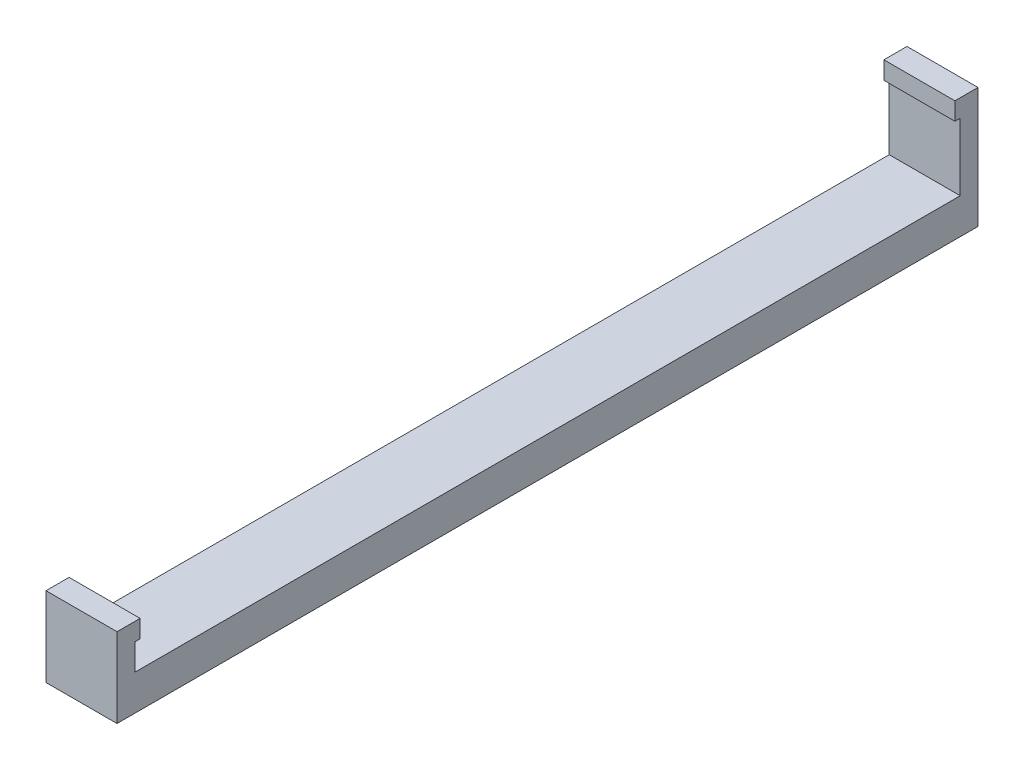
ISO-10303-21;
HEADER;
FILE_DESCRIPTION(('STEP AP214'),'2;1');
FILE_NAME('part.step','',(''),(''),'','','');
FILE_SCHEMA(('AUTOMOTIVE_DESIGN { 1 0 10303 214 1 1 1 1 }'));
ENDSEC;
DATA;
#1=APPLICATION_CONTEXT('core data for automotive mechanical design processes');
#2=APPLICATION_PROTOCOL_DEFINITION('international standard','automotive_design',2000,#1);
#3=PRODUCT_CONTEXT('',#1,'mechanical');
#4=PRODUCT('Part','Part','',(#3));
#5=PRODUCT_RELATED_PRODUCT_CATEGORY('part','',(#4));
#6=PRODUCT_DEFINITION_FORMATION('','',#4);
#7=PRODUCT_DEFINITION_CONTEXT('part definition',#1,'design');
#8=PRODUCT_DEFINITION('design','',#6,#7);
#9=PRODUCT_DEFINITION_SHAPE('','',#8);
#10=(LENGTH_UNIT() NAMED_UNIT(*) SI_UNIT(.MILLI.,.METRE.));
#11=(NAMED_UNIT(*) PLANE_ANGLE_UNIT() SI_UNIT($,.RADIAN.));
#12=(NAMED_UNIT(*) SI_UNIT($,.STERADIAN.) SOLID_ANGLE_UNIT());
#13=UNCERTAINTY_MEASURE_WITH_UNIT(LENGTH_MEASURE(1.E-05),#10,'distance_accuracy_value','');
#14=(GEOMETRIC_REPRESENTATION_CONTEXT(3) GLOBAL_UNCERTAINTY_ASSIGNED_CONTEXT((#13)) GLOBAL_UNIT_ASSIGNED_CONTEXT((#10,
#11,#12)) REPRESENTATION_CONTEXT('',''));
#15=CARTESIAN_POINT('',(0.,0.,0.));
#16=DIRECTION('',(0.,0.,1.));
#17=DIRECTION('',(1.,0.,0.));
#18=AXIS2_PLACEMENT_3D('',#15,#16,#17);
#19=CARTESIAN_POINT('',(10.,5.,0.));
#20=DIRECTION('',(-1.,0.,0.));
#21=DIRECTION('',(0.,0.,1.));
#22=AXIS2_PLACEMENT_3D('',#19,#20,#21);
#23=PLANE('',#22);
#24=DIRECTION('',(0.,0.,-1.));
#25=VECTOR('',#24,1.);
#26=CARTESIAN_POINT('',(10.,0.,0.));
#27=LINE('',#26,#25);
#28=CARTESIAN_POINT('',(10.,0.,2.5));
#29=VERTEX_POINT('',#28);
#30=CARTESIAN_POINT('',(9.99999999999998,0.,-118.72));
#31=VERTEX_POINT('',#30);
#32=EDGE_CURVE('E137',#29,#31,#27,.T.);
#33=ORIENTED_EDGE('',*,*,#32,.T.);
#34=DIRECTION('',(0.,1.,0.));
#35=VECTOR('',#34,1.);
#36=CARTESIAN_POINT('',(9.99999999999998,14.45,-118.72));
#37=LINE('',#36,#35);
#38=CARTESIAN_POINT('',(9.99999999999998,16.95,-118.72));
#39=VERTEX_POINT('',#38);
#40=EDGE_CURVE('E144',#31,#39,#37,.T.);
#41=ORIENTED_EDGE('',*,*,#40,.T.);
#42=DIRECTION('',(0.,0.,1.));
#43=VECTOR('',#42,1.);
#44=CARTESIAN_POINT('',(9.99999999999998,16.95,-118.72));
#45=LINE('',#44,#43);
#46=CARTESIAN_POINT('',(9.99999999999998,16.95,-115.47));
#47=VERTEX_POINT('',#46);
#48=EDGE_CURVE('E177',#39,#47,#45,.T.);
#49=ORIENTED_EDGE('',*,*,#48,.T.);
#50=DIRECTION('',(0.,-1.,0.));
#51=VECTOR('',#50,1.);
#52=CARTESIAN_POINT('',(9.99999999999998,14.45,-115.47));
#53=LINE('',#52,#51);
#54=CARTESIAN_POINT('',(9.99999999999998,14.45,-115.47));
#55=VERTEX_POINT('',#54);
#56=EDGE_CURVE('E181',#47,#55,#53,.T.);
#57=ORIENTED_EDGE('',*,*,#56,.T.);
#58=DIRECTION('',(0.,0.,-1.));
#59=VECTOR('',#58,1.);
#60=CARTESIAN_POINT('',(9.99999999999998,14.45,-115.47));
#61=LINE('',#60,#59);
#62=CARTESIAN_POINT('',(9.99999999999998,14.45,-116.22));
#63=VERTEX_POINT('',#62);
#64=EDGE_CURVE('E162',#55,#63,#61,.T.);
#65=ORIENTED_EDGE('',*,*,#64,.T.);
#66=DIRECTION('',(0.,-1.,0.));
#67=VECTOR('',#66,1.);
#68=CARTESIAN_POINT('',(9.99999999999998,0.,-116.22));
#69=LINE('',#68,#67);
#70=CARTESIAN_POINT('',(9.99999999999998,5.,-116.22));
#71=VERTEX_POINT('',#70);
#72=EDGE_CURVE('E171',#63,#71,#69,.T.);
#73=ORIENTED_EDGE('',*,*,#72,.T.);
#74=DIRECTION('',(0.,0.,-1.));
#75=VECTOR('',#74,1.);
#76=CARTESIAN_POINT('',(10.,5.,0.));
#77=LINE('',#76,#75);
#78=CARTESIAN_POINT('',(10.,5.,0.));
#79=VERTEX_POINT('',#78);
#80=EDGE_CURVE('E254',#79,#71,#77,.T.);
#81=ORIENTED_EDGE('',*,*,#80,.F.);
#82=DIRECTION('',(0.,1.,0.));
#83=VECTOR('',#82,1.);
#84=CARTESIAN_POINT('',(10.,0.,0.));
#85=LINE('',#84,#83);
#86=CARTESIAN_POINT('',(10.,8.7,0.));
#87=VERTEX_POINT('',#86);
#88=EDGE_CURVE('E191',#79,#87,#85,.T.);
#89=ORIENTED_EDGE('',*,*,#88,.T.);
#90=DIRECTION('',(0.,0.,-1.));
#91=VECTOR('',#90,1.);
#92=CARTESIAN_POINT('',(10.,8.7,-0.750000000000002));
#93=LINE('',#92,#91);
#94=CARTESIAN_POINT('',(10.,8.7,-0.750000000000002));
#95=VERTEX_POINT('',#94);
#96=EDGE_CURVE('E222',#87,#95,#93,.T.);
#97=ORIENTED_EDGE('',*,*,#96,.T.);
#98=DIRECTION('',(0.,1.,0.));
#99=VECTOR('',#98,1.);
#100=CARTESIAN_POINT('',(10.,8.7,-0.750000000000002));
#101=LINE('',#100,#99);
#102=CARTESIAN_POINT('',(10.,11.2,-0.750000000000002));
#103=VERTEX_POINT('',#102);
#104=EDGE_CURVE('E226',#95,#103,#101,.T.);
#105=ORIENTED_EDGE('',*,*,#104,.T.);
#106=DIRECTION('',(0.,0.,1.));
#107=VECTOR('',#106,1.);
#108=CARTESIAN_POINT('',(10.,11.2,2.5));
#109=LINE('',#108,#107);
#110=CARTESIAN_POINT('',(10.,11.2,2.5));
#111=VERTEX_POINT('',#110);
#112=EDGE_CURVE('E230',#103,#111,#109,.T.);
#113=ORIENTED_EDGE('',*,*,#112,.T.);
#114=DIRECTION('',(0.,-1.,0.));
#115=VECTOR('',#114,1.);
#116=CARTESIAN_POINT('',(10.,0.,2.5));
#117=LINE('',#116,#115);
#118=EDGE_CURVE('E204',#111,#29,#117,.T.);
#119=ORIENTED_EDGE('',*,*,#118,.T.);
#120=EDGE_LOOP('',(#33,#41,#49,#57,#65,#73,#81,#89,#97,#105,#113,#119));
#121=FACE_BOUND('',#120,.T.);
#122=ADVANCED_FACE('F39',(#121),#23,.F.);
#123=CARTESIAN_POINT('',(0.,5.,0.));
#124=DIRECTION('',(1.,0.,0.));
#125=DIRECTION('',(0.,0.,-1.));
#126=AXIS2_PLACEMENT_3D('',#123,#124,#125);
#127=PLANE('',#126);
#128=DIRECTION('',(0.,0.,1.));
#129=VECTOR('',#128,1.);
#130=CARTESIAN_POINT('',(0.,0.,0.));
#131=LINE('',#130,#129);
#132=CARTESIAN_POINT('',(0.,0.,-118.72));
#133=VERTEX_POINT('',#132);
#134=CARTESIAN_POINT('',(0.,0.,2.5));
#135=VERTEX_POINT('',#134);
#136=EDGE_CURVE('E42',#133,#135,#131,.T.);
#137=ORIENTED_EDGE('',*,*,#136,.T.);
#138=DIRECTION('',(0.,-1.,0.));
#139=VECTOR('',#138,1.);
#140=CARTESIAN_POINT('',(0.,8.7,2.5));
#141=LINE('',#140,#139);
#142=CARTESIAN_POINT('',(0.,11.2,2.5));
#143=VERTEX_POINT('',#142);
#144=EDGE_CURVE('E216',#143,#135,#141,.T.);
#145=ORIENTED_EDGE('',*,*,#144,.F.);
#146=DIRECTION('',(0.,0.,1.));
#147=VECTOR('',#146,1.);
#148=CARTESIAN_POINT('',(0.,11.2,2.5));
#149=LINE('',#148,#147);
#150=CARTESIAN_POINT('',(0.,11.2,-0.75));
#151=VERTEX_POINT('',#150);
#152=EDGE_CURVE('E212',#151,#143,#149,.T.);
#153=ORIENTED_EDGE('',*,*,#152,.F.);
#154=DIRECTION('',(0.,1.,0.));
#155=VECTOR('',#154,1.);
#156=CARTESIAN_POINT('',(0.,8.7,-0.75));
#157=LINE('',#156,#155);
#158=CARTESIAN_POINT('',(0.,8.7,-0.75));
#159=VERTEX_POINT('',#158);
#160=EDGE_CURVE('E208',#159,#151,#157,.T.);
#161=ORIENTED_EDGE('',*,*,#160,.F.);
#162=DIRECTION('',(0.,0.,-1.));
#163=VECTOR('',#162,1.);
#164=CARTESIAN_POINT('',(0.,8.7,-0.75));
#165=LINE('',#164,#163);
#166=CARTESIAN_POINT('',(0.,8.7,0.));
#167=VERTEX_POINT('',#166);
#168=EDGE_CURVE('E203',#167,#159,#165,.T.);
#169=ORIENTED_EDGE('',*,*,#168,.F.);
#170=DIRECTION('',(0.,1.,0.));
#171=VECTOR('',#170,1.);
#172=CARTESIAN_POINT('',(0.,0.,0.));
#173=LINE('',#172,#171);
#174=CARTESIAN_POINT('',(0.,5.,0.));
#175=VERTEX_POINT('',#174);
#176=EDGE_CURVE('E200',#175,#167,#173,.T.);
#177=ORIENTED_EDGE('',*,*,#176,.F.);
#178=DIRECTION('',(0.,0.,1.));
#179=VECTOR('',#178,1.);
#180=CARTESIAN_POINT('',(0.,5.,0.));
#181=LINE('',#180,#179);
#182=CARTESIAN_POINT('',(0.,5.,-116.22));
#183=VERTEX_POINT('',#182);
#184=EDGE_CURVE('E11',#183,#175,#181,.T.);
#185=ORIENTED_EDGE('',*,*,#184,.F.);
#186=DIRECTION('',(0.,-1.,0.));
#187=VECTOR('',#186,1.);
#188=CARTESIAN_POINT('',(0.,0.,-116.22));
#189=LINE('',#188,#187);
#190=CARTESIAN_POINT('',(0.,14.45,-116.22));
#191=VERTEX_POINT('',#190);
#192=EDGE_CURVE('E155',#191,#183,#189,.T.);
#193=ORIENTED_EDGE('',*,*,#192,.F.);
#194=DIRECTION('',(0.,0.,-1.));
#195=VECTOR('',#194,1.);
#196=CARTESIAN_POINT('',(0.,14.45,-115.47));
#197=LINE('',#196,#195);
#198=CARTESIAN_POINT('',(0.,14.45,-115.47));
#199=VERTEX_POINT('',#198);
#200=EDGE_CURVE('E147',#199,#191,#197,.T.);
#201=ORIENTED_EDGE('',*,*,#200,.F.);
#202=DIRECTION('',(0.,-1.,0.));
#203=VECTOR('',#202,1.);
#204=CARTESIAN_POINT('',(0.,14.45,-115.47));
#205=LINE('',#204,#203);
#206=CARTESIAN_POINT('',(0.,16.95,-115.47));
#207=VERTEX_POINT('',#206);
#208=EDGE_CURVE('E159',#207,#199,#205,.T.);
#209=ORIENTED_EDGE('',*,*,#208,.F.);
#210=DIRECTION('',(0.,0.,1.));
#211=VECTOR('',#210,1.);
#212=CARTESIAN_POINT('',(0.,16.95,-118.72));
#213=LINE('',#212,#211);
#214=CARTESIAN_POINT('',(0.,16.95,-118.72));
#215=VERTEX_POINT('',#214);
#216=EDGE_CURVE('E153',#215,#207,#213,.T.);
#217=ORIENTED_EDGE('',*,*,#216,.F.);
#218=DIRECTION('',(0.,1.,0.));
#219=VECTOR('',#218,1.);
#220=CARTESIAN_POINT('',(0.,0.,-118.72));
#221=LINE('',#220,#219);
#222=EDGE_CURVE('E141',#133,#215,#221,.T.);
#223=ORIENTED_EDGE('',*,*,#222,.F.);
#224=EDGE_LOOP('',(#137,#145,#153,#161,#169,#177,#185,#193,#201,#209,#217,#223));
#225=FACE_BOUND('',#224,.T.);
#226=ADVANCED_FACE('F150',(#225),#127,.F.);
#227=CARTESIAN_POINT('',(0.,5.,0.));
#228=DIRECTION('',(0.,1.,0.));
#229=DIRECTION('',(0.,0.,1.));
#230=AXIS2_PLACEMENT_3D('',#227,#228,#229);
#231=PLANE('',#230);
#232=DIRECTION('',(1.,0.,0.));
#233=VECTOR('',#232,1.);
#234=CARTESIAN_POINT('',(0.,5.,0.));
#235=LINE('',#234,#233);
#236=EDGE_CURVE('E136',#175,#79,#235,.T.);
#237=ORIENTED_EDGE('',*,*,#236,.T.);
#238=ORIENTED_EDGE('',*,*,#80,.T.);
#239=DIRECTION('',(-1.,0.,0.));
#240=VECTOR('',#239,1.);
#241=CARTESIAN_POINT('',(0.,5.,-116.22));
#242=LINE('',#241,#240);
#243=EDGE_CURVE('E48',#71,#183,#242,.T.);
#244=ORIENTED_EDGE('',*,*,#243,.T.);
#245=ORIENTED_EDGE('',*,*,#184,.T.);
#246=EDGE_LOOP('',(#237,#238,#244,#245));
#247=FACE_BOUND('',#246,.T.);
#248=ADVANCED_FACE('F305',(#247),#231,.T.);
#249=CARTESIAN_POINT('',(0.,0.,0.));
#250=DIRECTION('',(0.,1.,0.));
#251=DIRECTION('',(0.,0.,1.));
#252=AXIS2_PLACEMENT_3D('',#249,#250,#251);
#253=PLANE('',#252);
#254=ORIENTED_EDGE('',*,*,#32,.F.);
#255=DIRECTION('',(1.,0.,0.));
#256=VECTOR('',#255,1.);
#257=CARTESIAN_POINT('',(0.,0.,2.5));
#258=LINE('',#257,#256);
#259=EDGE_CURVE('E130',#135,#29,#258,.T.);
#260=ORIENTED_EDGE('',*,*,#259,.F.);
#261=ORIENTED_EDGE('',*,*,#136,.F.);
#262=DIRECTION('',(1.,0.,0.));
#263=VECTOR('',#262,1.);
#264=CARTESIAN_POINT('',(0.,0.,-118.72));
#265=LINE('',#264,#263);
#266=EDGE_CURVE('E128',#133,#31,#265,.T.);
#267=ORIENTED_EDGE('',*,*,#266,.T.);
#268=EDGE_LOOP('',(#254,#260,#261,#267));
#269=FACE_BOUND('',#268,.T.);
#270=ADVANCED_FACE('F127',(#269),#253,.F.);
#271=CARTESIAN_POINT('',(0.,0.,0.));
#272=DIRECTION('',(0.,0.,-1.));
#273=DIRECTION('',(-1.,0.,0.));
#274=AXIS2_PLACEMENT_3D('',#271,#272,#273);
#275=PLANE('',#274);
#276=ORIENTED_EDGE('',*,*,#88,.F.);
#277=ORIENTED_EDGE('',*,*,#236,.F.);
#278=ORIENTED_EDGE('',*,*,#176,.T.);
#279=DIRECTION('',(1.,0.,0.));
#280=VECTOR('',#279,1.);
#281=CARTESIAN_POINT('',(0.,8.7,0.));
#282=LINE('',#281,#280);
#283=EDGE_CURVE('E219',#167,#87,#282,.T.);
#284=ORIENTED_EDGE('',*,*,#283,.T.);
#285=EDGE_LOOP('',(#276,#277,#278,#284));
#286=FACE_BOUND('',#285,.T.);
#287=ADVANCED_FACE('F278',(#286),#275,.T.);
#288=CARTESIAN_POINT('',(0.,0.,2.5));
#289=DIRECTION('',(0.,0.,1.));
#290=DIRECTION('',(1.,0.,0.));
#291=AXIS2_PLACEMENT_3D('',#288,#289,#290);
#292=PLANE('',#291);
#293=ORIENTED_EDGE('',*,*,#118,.F.);
#294=DIRECTION('',(1.,0.,0.));
#295=VECTOR('',#294,1.);
#296=CARTESIAN_POINT('',(0.,11.2,2.5));
#297=LINE('',#296,#295);
#298=EDGE_CURVE('E239',#143,#111,#297,.T.);
#299=ORIENTED_EDGE('',*,*,#298,.F.);
#300=ORIENTED_EDGE('',*,*,#144,.T.);
#301=ORIENTED_EDGE('',*,*,#259,.T.);
#302=EDGE_LOOP('',(#293,#299,#300,#301));
#303=FACE_BOUND('',#302,.T.);
#304=ADVANCED_FACE('F261',(#303),#292,.T.);
#305=CARTESIAN_POINT('',(0.,11.2,2.5));
#306=DIRECTION('',(0.,1.,0.));
#307=DIRECTION('',(0.,0.,1.));
#308=AXIS2_PLACEMENT_3D('',#305,#306,#307);
#309=PLANE('',#308);
#310=ORIENTED_EDGE('',*,*,#112,.F.);
#311=DIRECTION('',(1.,0.,0.));
#312=VECTOR('',#311,1.);
#313=CARTESIAN_POINT('',(0.,11.2,-0.75));
#314=LINE('',#313,#312);
#315=EDGE_CURVE('E243',#151,#103,#314,.T.);
#316=ORIENTED_EDGE('',*,*,#315,.F.);
#317=ORIENTED_EDGE('',*,*,#152,.T.);
#318=ORIENTED_EDGE('',*,*,#298,.T.);
#319=EDGE_LOOP('',(#310,#316,#317,#318));
#320=FACE_BOUND('',#319,.T.);
#321=ADVANCED_FACE('F266',(#320),#309,.T.);
#322=CARTESIAN_POINT('',(0.,8.7,-0.75));
#323=DIRECTION('',(0.,0.,-1.));
#324=DIRECTION('',(-1.,0.,0.));
#325=AXIS2_PLACEMENT_3D('',#322,#323,#324);
#326=PLANE('',#325);
#327=ORIENTED_EDGE('',*,*,#104,.F.);
#328=DIRECTION('',(1.,0.,0.));
#329=VECTOR('',#328,1.);
#330=CARTESIAN_POINT('',(0.,8.7,-0.75));
#331=LINE('',#330,#329);
#332=EDGE_CURVE('E246',#159,#95,#331,.T.);
#333=ORIENTED_EDGE('',*,*,#332,.F.);
#334=ORIENTED_EDGE('',*,*,#160,.T.);
#335=ORIENTED_EDGE('',*,*,#315,.T.);
#336=EDGE_LOOP('',(#327,#333,#334,#335));
#337=FACE_BOUND('',#336,.T.);
#338=ADVANCED_FACE('F269',(#337),#326,.T.);
#339=CARTESIAN_POINT('',(0.,8.7,-0.75));
#340=DIRECTION('',(0.,-1.,0.));
#341=DIRECTION('',(0.,0.,-1.));
#342=AXIS2_PLACEMENT_3D('',#339,#340,#341);
#343=PLANE('',#342);
#344=ORIENTED_EDGE('',*,*,#96,.F.);
#345=ORIENTED_EDGE('',*,*,#283,.F.);
#346=ORIENTED_EDGE('',*,*,#168,.T.);
#347=ORIENTED_EDGE('',*,*,#332,.T.);
#348=EDGE_LOOP('',(#344,#345,#346,#347));
#349=FACE_BOUND('',#348,.T.);
#350=ADVANCED_FACE('F275',(#349),#343,.T.);
#351=CARTESIAN_POINT('',(0.,0.,-116.22));
#352=DIRECTION('',(0.,0.,1.));
#353=DIRECTION('',(1.,0.,0.));
#354=AXIS2_PLACEMENT_3D('',#351,#352,#353);
#355=PLANE('',#354);
#356=ORIENTED_EDGE('',*,*,#192,.T.);
#357=ORIENTED_EDGE('',*,*,#243,.F.);
#358=ORIENTED_EDGE('',*,*,#72,.F.);
#359=DIRECTION('',(1.,0.,0.));
#360=VECTOR('',#359,1.);
#361=CARTESIAN_POINT('',(0.,14.45,-116.22));
#362=LINE('',#361,#360);
#363=EDGE_CURVE('E188',#191,#63,#362,.T.);
#364=ORIENTED_EDGE('',*,*,#363,.F.);
#365=EDGE_LOOP('',(#356,#357,#358,#364));
#366=FACE_BOUND('',#365,.T.);
#367=ADVANCED_FACE('F282',(#366),#355,.T.);
#368=CARTESIAN_POINT('',(0.,14.45,-115.47));
#369=DIRECTION('',(0.,-1.,0.));
#370=DIRECTION('',(0.,0.,-1.));
#371=AXIS2_PLACEMENT_3D('',#368,#369,#370);
#372=PLANE('',#371);
#373=ORIENTED_EDGE('',*,*,#64,.F.);
#374=DIRECTION('',(1.,0.,0.));
#375=VECTOR('',#374,1.);
#376=CARTESIAN_POINT('',(0.,14.45,-115.47));
#377=LINE('',#376,#375);
#378=EDGE_CURVE('E192',#199,#55,#377,.T.);
#379=ORIENTED_EDGE('',*,*,#378,.F.);
#380=ORIENTED_EDGE('',*,*,#200,.T.);
#381=ORIENTED_EDGE('',*,*,#363,.T.);
#382=EDGE_LOOP('',(#373,#379,#380,#381));
#383=FACE_BOUND('',#382,.T.);
#384=ADVANCED_FACE('F286',(#383),#372,.T.);
#385=CARTESIAN_POINT('',(0.,14.45,-115.47));
#386=DIRECTION('',(0.,0.,1.));
#387=DIRECTION('',(1.,0.,0.));
#388=AXIS2_PLACEMENT_3D('',#385,#386,#387);
#389=PLANE('',#388);
#390=ORIENTED_EDGE('',*,*,#56,.F.);
#391=DIRECTION('',(1.,0.,0.));
#392=VECTOR('',#391,1.);
#393=CARTESIAN_POINT('',(0.,16.95,-115.47));
#394=LINE('',#393,#392);
#395=EDGE_CURVE('E195',#207,#47,#394,.T.);
#396=ORIENTED_EDGE('',*,*,#395,.F.);
#397=ORIENTED_EDGE('',*,*,#208,.T.);
#398=ORIENTED_EDGE('',*,*,#378,.T.);
#399=EDGE_LOOP('',(#390,#396,#397,#398));
#400=FACE_BOUND('',#399,.T.);
#401=ADVANCED_FACE('F292',(#400),#389,.T.);
#402=CARTESIAN_POINT('',(0.,16.95,-118.72));
#403=DIRECTION('',(0.,1.,0.));
#404=DIRECTION('',(0.,0.,1.));
#405=AXIS2_PLACEMENT_3D('',#402,#403,#404);
#406=PLANE('',#405);
#407=ORIENTED_EDGE('',*,*,#48,.F.);
#408=DIRECTION('',(1.,0.,0.));
#409=VECTOR('',#408,1.);
#410=CARTESIAN_POINT('',(0.,16.95,-118.72));
#411=LINE('',#410,#409);
#412=EDGE_CURVE('E146',#215,#39,#411,.T.);
#413=ORIENTED_EDGE('',*,*,#412,.F.);
#414=ORIENTED_EDGE('',*,*,#216,.T.);
#415=ORIENTED_EDGE('',*,*,#395,.T.);
#416=EDGE_LOOP('',(#407,#413,#414,#415));
#417=FACE_BOUND('',#416,.T.);
#418=ADVANCED_FACE('F290',(#417),#406,.T.);
#419=CARTESIAN_POINT('',(0.,14.45,-118.72));
#420=DIRECTION('',(0.,0.,-1.));
#421=DIRECTION('',(-1.,0.,0.));
#422=AXIS2_PLACEMENT_3D('',#419,#420,#421);
#423=PLANE('',#422);
#424=ORIENTED_EDGE('',*,*,#40,.F.);
#425=ORIENTED_EDGE('',*,*,#266,.F.);
#426=ORIENTED_EDGE('',*,*,#222,.T.);
#427=ORIENTED_EDGE('',*,*,#412,.T.);
#428=EDGE_LOOP('',(#424,#425,#426,#427));
#429=FACE_BOUND('',#428,.T.);
#430=ADVANCED_FACE('F140',(#429),#423,.T.);
#431=CLOSED_SHELL('',(#122,#226,#248,#270,#287,#304,#321,#338,#350,#367,#384,#401,#418,#430));
#432=MANIFOLD_SOLID_BREP('B2',#431);
#433=ADVANCED_BREP_SHAPE_REPRESENTATION('',(#18,#432),#14);
#434=SHAPE_DEFINITION_REPRESENTATION(#9,#433);
ENDSEC;
END-ISO-10303-21;
